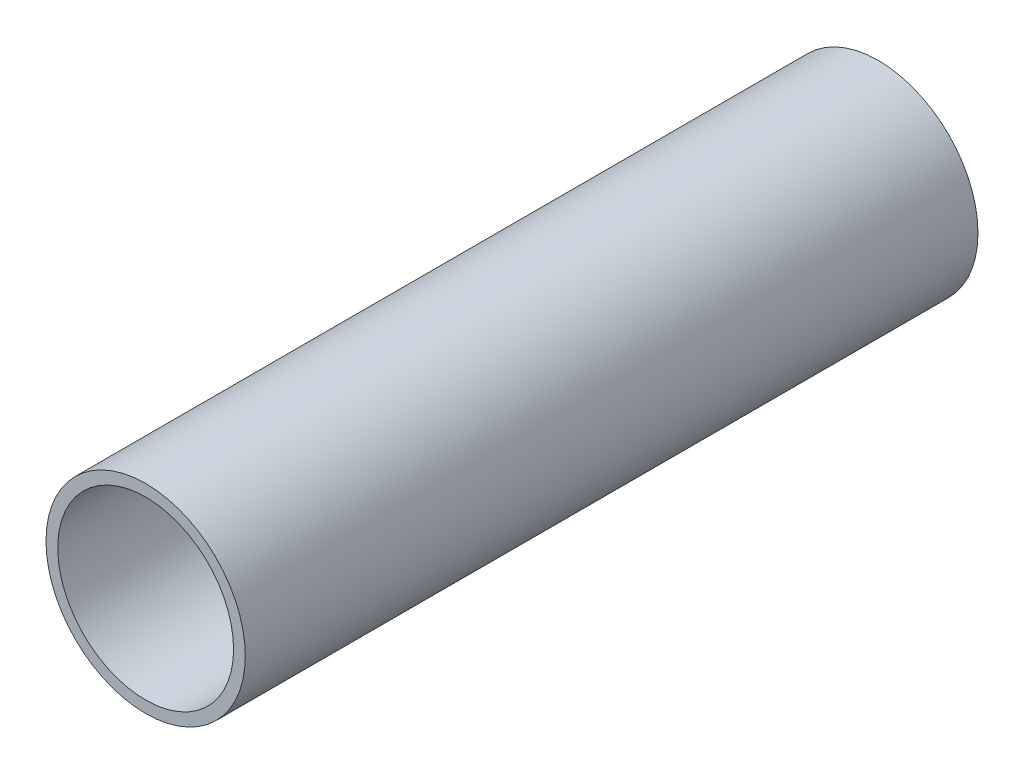
ISO-10303-21;
HEADER;
FILE_DESCRIPTION(('STEP AP214'),'2;1');
FILE_NAME('part.step','',(''),(''),'','','');
FILE_SCHEMA(('AUTOMOTIVE_DESIGN { 1 0 10303 214 1 1 1 1 }'));
ENDSEC;
DATA;
#1=APPLICATION_CONTEXT('core data for automotive mechanical design processes');
#2=APPLICATION_PROTOCOL_DEFINITION('international standard','automotive_design',2000,#1);
#3=PRODUCT_CONTEXT('',#1,'mechanical');
#4=PRODUCT('Part','Part','',(#3));
#5=PRODUCT_RELATED_PRODUCT_CATEGORY('part','',(#4));
#6=PRODUCT_DEFINITION_FORMATION('','',#4);
#7=PRODUCT_DEFINITION_CONTEXT('part definition',#1,'design');
#8=PRODUCT_DEFINITION('design','',#6,#7);
#9=PRODUCT_DEFINITION_SHAPE('','',#8);
#10=(LENGTH_UNIT() NAMED_UNIT(*) SI_UNIT(.MILLI.,.METRE.));
#11=(NAMED_UNIT(*) PLANE_ANGLE_UNIT() SI_UNIT($,.RADIAN.));
#12=(NAMED_UNIT(*) SI_UNIT($,.STERADIAN.) SOLID_ANGLE_UNIT());
#13=UNCERTAINTY_MEASURE_WITH_UNIT(LENGTH_MEASURE(1.E-05),#10,'distance_accuracy_value','');
#14=(GEOMETRIC_REPRESENTATION_CONTEXT(3) GLOBAL_UNCERTAINTY_ASSIGNED_CONTEXT((#13)) GLOBAL_UNIT_ASSIGNED_CONTEXT((#10,
#11,#12)) REPRESENTATION_CONTEXT('',''));
#15=CARTESIAN_POINT('',(0.,0.,0.));
#16=DIRECTION('',(0.,0.,1.));
#17=DIRECTION('',(1.,0.,0.));
#18=AXIS2_PLACEMENT_3D('',#15,#16,#17);
#19=CARTESIAN_POINT('',(0.,0.,100.));
#20=DIRECTION('',(0.,0.,1.));
#21=DIRECTION('',(1.,0.,0.));
#22=AXIS2_PLACEMENT_3D('',#19,#20,#21);
#23=PLANE('',#22);
#24=CARTESIAN_POINT('',(0.,0.,100.));
#25=DIRECTION('',(0.,0.,1.));
#26=DIRECTION('',(1.,0.,0.));
#27=AXIS2_PLACEMENT_3D('',#24,#25,#26);
#28=CIRCLE('',#27,13.6);
#29=CARTESIAN_POINT('',(13.6,0.,100.));
#30=VERTEX_POINT('',#29);
#31=EDGE_CURVE('E10',#30,#30,#28,.T.);
#32=ORIENTED_EDGE('',*,*,#31,.T.);
#33=EDGE_LOOP('',(#32));
#34=FACE_BOUND('',#33,.T.);
#35=CARTESIAN_POINT('',(0.,0.,100.));
#36=DIRECTION('',(0.,0.,1.));
#37=DIRECTION('',(1.,0.,0.));
#38=AXIS2_PLACEMENT_3D('',#35,#36,#37);
#39=CIRCLE('',#38,12.);
#40=CARTESIAN_POINT('',(12.,0.,100.));
#41=VERTEX_POINT('',#40);
#42=EDGE_CURVE('E48',#41,#41,#39,.T.);
#43=ORIENTED_EDGE('',*,*,#42,.F.);
#44=EDGE_LOOP('',(#43));
#45=FACE_BOUND('',#44,.T.);
#46=ADVANCED_FACE('F37',(#34,#45),#23,.T.);
#47=CARTESIAN_POINT('',(0.,0.,0.));
#48=DIRECTION('',(0.,0.,1.));
#49=DIRECTION('',(1.,0.,0.));
#50=AXIS2_PLACEMENT_3D('',#47,#48,#49);
#51=PLANE('',#50);
#52=CARTESIAN_POINT('',(0.,0.,0.));
#53=DIRECTION('',(0.,0.,1.));
#54=DIRECTION('',(1.,0.,0.));
#55=AXIS2_PLACEMENT_3D('',#52,#53,#54);
#56=CIRCLE('',#55,13.6);
#57=CARTESIAN_POINT('',(13.6,0.,0.));
#58=VERTEX_POINT('',#57);
#59=EDGE_CURVE('E41',#58,#58,#56,.T.);
#60=ORIENTED_EDGE('',*,*,#59,.F.);
#61=EDGE_LOOP('',(#60));
#62=FACE_BOUND('',#61,.T.);
#63=CARTESIAN_POINT('',(0.,0.,0.));
#64=DIRECTION('',(0.,0.,1.));
#65=DIRECTION('',(1.,0.,0.));
#66=AXIS2_PLACEMENT_3D('',#63,#64,#65);
#67=CIRCLE('',#66,12.);
#68=CARTESIAN_POINT('',(12.,0.,0.));
#69=VERTEX_POINT('',#68);
#70=EDGE_CURVE('E50',#69,#69,#67,.T.);
#71=ORIENTED_EDGE('',*,*,#70,.T.);
#72=EDGE_LOOP('',(#71));
#73=FACE_BOUND('',#72,.T.);
#74=ADVANCED_FACE('F60',(#62,#73),#51,.F.);
#75=CARTESIAN_POINT('',(0.,0.,100.));
#76=DIRECTION('',(0.,0.,-1.));
#77=DIRECTION('',(-1.,0.,0.));
#78=AXIS2_PLACEMENT_3D('',#75,#76,#77);
#79=CYLINDRICAL_SURFACE('',#78,13.6);
#80=ORIENTED_EDGE('',*,*,#31,.F.);
#81=EDGE_LOOP('',(#80));
#82=FACE_BOUND('',#81,.T.);
#83=ORIENTED_EDGE('',*,*,#59,.T.);
#84=EDGE_LOOP('',(#83));
#85=FACE_BOUND('',#84,.T.);
#86=ADVANCED_FACE('F39',(#82,#85),#79,.T.);
#87=CARTESIAN_POINT('',(0.,0.,100.));
#88=DIRECTION('',(0.,0.,-1.));
#89=DIRECTION('',(-1.,0.,0.));
#90=AXIS2_PLACEMENT_3D('',#87,#88,#89);
#91=CYLINDRICAL_SURFACE('',#90,12.);
#92=ORIENTED_EDGE('',*,*,#42,.T.);
#93=EDGE_LOOP('',(#92));
#94=FACE_BOUND('',#93,.T.);
#95=ORIENTED_EDGE('',*,*,#70,.F.);
#96=EDGE_LOOP('',(#95));
#97=FACE_BOUND('',#96,.T.);
#98=ADVANCED_FACE('F56',(#94,#97),#91,.F.);
#99=CLOSED_SHELL('',(#46,#74,#86,#98));
#100=MANIFOLD_SOLID_BREP('B2',#99);
#101=ADVANCED_BREP_SHAPE_REPRESENTATION('',(#18,#100),#14);
#102=SHAPE_DEFINITION_REPRESENTATION(#9,#101);
ENDSEC;
END-ISO-10303-21;
